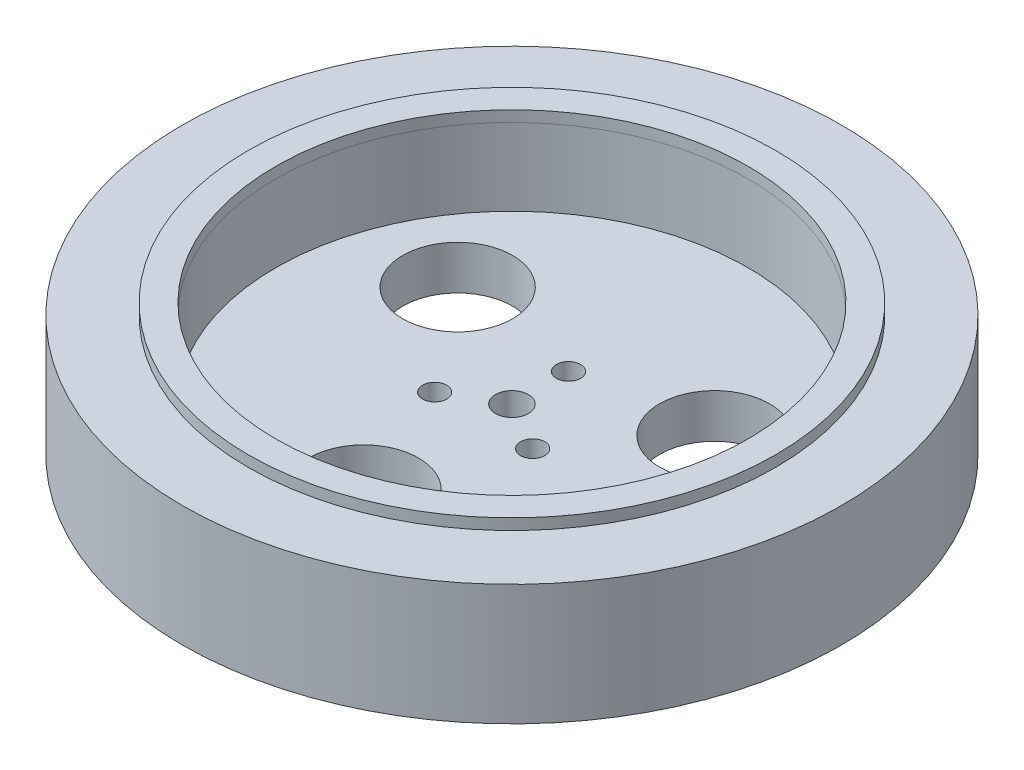
ISO-10303-21;
HEADER;
FILE_DESCRIPTION(('STEP AP214'),'2;1');
FILE_NAME('part.step','',(''),(''),'','','');
FILE_SCHEMA(('AUTOMOTIVE_DESIGN { 1 0 10303 214 1 1 1 1 }'));
ENDSEC;
DATA;
#1=APPLICATION_CONTEXT('core data for automotive mechanical design processes');
#2=APPLICATION_PROTOCOL_DEFINITION('international standard','automotive_design',2000,#1);
#3=PRODUCT_CONTEXT('',#1,'mechanical');
#4=PRODUCT('Part','Part','',(#3));
#5=PRODUCT_RELATED_PRODUCT_CATEGORY('part','',(#4));
#6=PRODUCT_DEFINITION_FORMATION('','',#4);
#7=PRODUCT_DEFINITION_CONTEXT('part definition',#1,'design');
#8=PRODUCT_DEFINITION('design','',#6,#7);
#9=PRODUCT_DEFINITION_SHAPE('','',#8);
#10=(LENGTH_UNIT() NAMED_UNIT(*) SI_UNIT(.MILLI.,.METRE.));
#11=(NAMED_UNIT(*) PLANE_ANGLE_UNIT() SI_UNIT($,.RADIAN.));
#12=(NAMED_UNIT(*) SI_UNIT($,.STERADIAN.) SOLID_ANGLE_UNIT());
#13=UNCERTAINTY_MEASURE_WITH_UNIT(LENGTH_MEASURE(1.E-05),#10,'distance_accuracy_value','');
#14=(GEOMETRIC_REPRESENTATION_CONTEXT(3) GLOBAL_UNCERTAINTY_ASSIGNED_CONTEXT((#13)) GLOBAL_UNIT_ASSIGNED_CONTEXT((#10,
#11,#12)) REPRESENTATION_CONTEXT('',''));
#15=CARTESIAN_POINT('',(0.,0.,0.));
#16=DIRECTION('',(0.,0.,1.));
#17=DIRECTION('',(1.,0.,0.));
#18=AXIS2_PLACEMENT_3D('',#15,#16,#17);
#19=CARTESIAN_POINT('',(0.,13.,0.));
#20=DIRECTION('',(0.,1.,0.));
#21=DIRECTION('',(0.,0.,1.));
#22=AXIS2_PLACEMENT_3D('',#19,#20,#21);
#23=PLANE('',#22);
#24=CARTESIAN_POINT('',(0.,13.,0.));
#25=DIRECTION('',(0.,1.,0.));
#26=DIRECTION('',(0.,0.,1.));
#27=AXIS2_PLACEMENT_3D('',#24,#25,#26);
#28=CIRCLE('',#27,24.);
#29=CARTESIAN_POINT('',(0.,13.,24.));
#30=VERTEX_POINT('',#29);
#31=EDGE_CURVE('E11',#30,#30,#28,.T.);
#32=ORIENTED_EDGE('',*,*,#31,.T.);
#33=EDGE_LOOP('',(#32));
#34=FACE_BOUND('',#33,.T.);
#35=CARTESIAN_POINT('',(0.,13.,0.));
#36=DIRECTION('',(0.,1.,0.));
#37=DIRECTION('',(0.,0.,1.));
#38=AXIS2_PLACEMENT_3D('',#35,#36,#37);
#39=CIRCLE('',#38,21.5);
#40=CARTESIAN_POINT('',(0.,13.,21.5));
#41=VERTEX_POINT('',#40);
#42=EDGE_CURVE('E54',#41,#41,#39,.T.);
#43=ORIENTED_EDGE('',*,*,#42,.F.);
#44=EDGE_LOOP('',(#43));
#45=FACE_BOUND('',#44,.T.);
#46=ADVANCED_FACE('F43',(#34,#45),#23,.T.);
#47=CARTESIAN_POINT('',(0.,12.,0.));
#48=DIRECTION('',(0.,1.,0.));
#49=DIRECTION('',(0.,0.,1.));
#50=AXIS2_PLACEMENT_3D('',#47,#48,#49);
#51=PLANE('',#50);
#52=CARTESIAN_POINT('',(0.,12.,0.));
#53=DIRECTION('',(0.,1.,0.));
#54=DIRECTION('',(0.,0.,1.));
#55=AXIS2_PLACEMENT_3D('',#52,#53,#54);
#56=CIRCLE('',#55,24.);
#57=CARTESIAN_POINT('',(0.,12.,24.));
#58=VERTEX_POINT('',#57);
#59=EDGE_CURVE('E47',#58,#58,#56,.T.);
#60=ORIENTED_EDGE('',*,*,#59,.F.);
#61=EDGE_LOOP('',(#60));
#62=FACE_BOUND('',#61,.T.);
#63=CARTESIAN_POINT('',(0.,12.,0.));
#64=DIRECTION('',(0.,1.,0.));
#65=DIRECTION('',(0.,0.,1.));
#66=AXIS2_PLACEMENT_3D('',#63,#64,#65);
#67=CIRCLE('',#66,21.5);
#68=CARTESIAN_POINT('',(0.,12.,21.5));
#69=VERTEX_POINT('',#68);
#70=EDGE_CURVE('E56',#69,#69,#67,.T.);
#71=ORIENTED_EDGE('',*,*,#70,.T.);
#72=EDGE_LOOP('',(#71));
#73=FACE_BOUND('',#72,.T.);
#74=ADVANCED_FACE('F66',(#62,#73),#51,.F.);
#75=CARTESIAN_POINT('',(0.,13.,0.));
#76=DIRECTION('',(0.,-1.,0.));
#77=DIRECTION('',(0.,0.,-1.));
#78=AXIS2_PLACEMENT_3D('',#75,#76,#77);
#79=CYLINDRICAL_SURFACE('',#78,24.);
#80=ORIENTED_EDGE('',*,*,#31,.F.);
#81=EDGE_LOOP('',(#80));
#82=FACE_BOUND('',#81,.T.);
#83=ORIENTED_EDGE('',*,*,#59,.T.);
#84=EDGE_LOOP('',(#83));
#85=FACE_BOUND('',#84,.T.);
#86=ADVANCED_FACE('F45',(#82,#85),#79,.T.);
#87=CARTESIAN_POINT('',(0.,13.,0.));
#88=DIRECTION('',(0.,-1.,0.));
#89=DIRECTION('',(0.,0.,-1.));
#90=AXIS2_PLACEMENT_3D('',#87,#88,#89);
#91=CYLINDRICAL_SURFACE('',#90,21.5);
#92=ORIENTED_EDGE('',*,*,#42,.T.);
#93=EDGE_LOOP('',(#92));
#94=FACE_BOUND('',#93,.T.);
#95=ORIENTED_EDGE('',*,*,#70,.F.);
#96=EDGE_LOOP('',(#95));
#97=FACE_BOUND('',#96,.T.);
#98=ADVANCED_FACE('F62',(#94,#97),#91,.F.);
#99=CLOSED_SHELL('',(#46,#74,#86,#98));
#100=MANIFOLD_SOLID_BREP('B2',#99);
#101=CARTESIAN_POINT('',(0.,1.,0.));
#102=DIRECTION('',(0.,1.,0.));
#103=DIRECTION('',(0.,0.,1.));
#104=AXIS2_PLACEMENT_3D('',#101,#102,#103);
#105=CYLINDRICAL_SURFACE('',#104,30.);
#106=CARTESIAN_POINT('',(0.,1.,0.));
#107=DIRECTION('',(0.,1.,0.));
#108=DIRECTION('',(0.,0.,1.));
#109=AXIS2_PLACEMENT_3D('',#106,#107,#108);
#110=CIRCLE('',#109,30.);
#111=CARTESIAN_POINT('',(0.,1.,30.));
#112=VERTEX_POINT('',#111);
#113=EDGE_CURVE('E42',#112,#112,#110,.T.);
#114=ORIENTED_EDGE('',*,*,#113,.T.);
#115=EDGE_LOOP('',(#114));
#116=FACE_BOUND('',#115,.T.);
#117=CARTESIAN_POINT('',(0.,12.,0.));
#118=DIRECTION('',(0.,1.,0.));
#119=DIRECTION('',(0.,0.,1.));
#120=AXIS2_PLACEMENT_3D('',#117,#118,#119);
#121=CIRCLE('',#120,30.);
#122=CARTESIAN_POINT('',(0.,12.,30.));
#123=VERTEX_POINT('',#122);
#124=EDGE_CURVE('E120',#123,#123,#121,.T.);
#125=ORIENTED_EDGE('',*,*,#124,.F.);
#126=EDGE_LOOP('',(#125));
#127=FACE_BOUND('',#126,.T.);
#128=ADVANCED_FACE('F117',(#116,#127),#105,.T.);
#129=CARTESIAN_POINT('',(0.,1.,0.));
#130=DIRECTION('',(0.,1.,0.));
#131=DIRECTION('',(0.,0.,1.));
#132=AXIS2_PLACEMENT_3D('',#129,#130,#131);
#133=PLANE('',#132);
#134=CARTESIAN_POINT('',(0.,1.,0.));
#135=DIRECTION('',(0.,1.,0.));
#136=DIRECTION('',(0.,0.,1.));
#137=AXIS2_PLACEMENT_3D('',#134,#135,#136);
#138=CIRCLE('',#137,24.);
#139=CARTESIAN_POINT('',(0.,1.,24.));
#140=VERTEX_POINT('',#139);
#141=EDGE_CURVE('E127',#140,#140,#138,.T.);
#142=ORIENTED_EDGE('',*,*,#141,.T.);
#143=EDGE_LOOP('',(#142));
#144=FACE_BOUND('',#143,.T.);
#145=ORIENTED_EDGE('',*,*,#113,.F.);
#146=EDGE_LOOP('',(#145));
#147=FACE_BOUND('',#146,.T.);
#148=ADVANCED_FACE('F135',(#144,#147),#133,.F.);
#149=CARTESIAN_POINT('',(0.,12.,0.));
#150=DIRECTION('',(0.,1.,0.));
#151=DIRECTION('',(0.,0.,1.));
#152=AXIS2_PLACEMENT_3D('',#149,#150,#151);
#153=PLANE('',#152);
#154=CARTESIAN_POINT('',(0.,12.,0.));
#155=DIRECTION('',(0.,1.,0.));
#156=DIRECTION('',(0.,0.,1.));
#157=AXIS2_PLACEMENT_3D('',#154,#155,#156);
#158=CIRCLE('',#157,24.);
#159=CARTESIAN_POINT('',(0.,12.,24.));
#160=VERTEX_POINT('',#159);
#161=EDGE_CURVE('E129',#160,#160,#158,.T.);
#162=ORIENTED_EDGE('',*,*,#161,.F.);
#163=EDGE_LOOP('',(#162));
#164=FACE_BOUND('',#163,.T.);
#165=ORIENTED_EDGE('',*,*,#124,.T.);
#166=EDGE_LOOP('',(#165));
#167=FACE_BOUND('',#166,.T.);
#168=ADVANCED_FACE('F141',(#164,#167),#153,.T.);
#169=CARTESIAN_POINT('',(0.,1.,0.));
#170=DIRECTION('',(0.,1.,0.));
#171=DIRECTION('',(0.,0.,1.));
#172=AXIS2_PLACEMENT_3D('',#169,#170,#171);
#173=CYLINDRICAL_SURFACE('',#172,24.);
#174=ORIENTED_EDGE('',*,*,#141,.F.);
#175=EDGE_LOOP('',(#174));
#176=FACE_BOUND('',#175,.T.);
#177=ORIENTED_EDGE('',*,*,#161,.T.);
#178=EDGE_LOOP('',(#177));
#179=FACE_BOUND('',#178,.T.);
#180=ADVANCED_FACE('F138',(#176,#179),#173,.F.);
#181=CLOSED_SHELL('',(#128,#148,#168,#180));
#182=MANIFOLD_SOLID_BREP('B6',#181);
#183=CARTESIAN_POINT('',(0.,12.,0.));
#184=DIRECTION('',(0.,-1.,0.));
#185=DIRECTION('',(0.,0.,-1.));
#186=AXIS2_PLACEMENT_3D('',#183,#184,#185);
#187=CYLINDRICAL_SURFACE('',#186,24.);
#188=CARTESIAN_POINT('',(0.,12.,0.));
#189=DIRECTION('',(0.,1.,0.));
#190=DIRECTION('',(0.,0.,1.));
#191=AXIS2_PLACEMENT_3D('',#188,#189,#190);
#192=CIRCLE('',#191,24.);
#193=CARTESIAN_POINT('',(0.,12.,24.));
#194=VERTEX_POINT('',#193);
#195=EDGE_CURVE('E116',#194,#194,#192,.T.);
#196=ORIENTED_EDGE('',*,*,#195,.F.);
#197=EDGE_LOOP('',(#196));
#198=FACE_BOUND('',#197,.T.);
#199=CARTESIAN_POINT('',(0.,1.,0.));
#200=DIRECTION('',(0.,-1.,0.));
#201=DIRECTION('',(0.,0.,-1.));
#202=AXIS2_PLACEMENT_3D('',#199,#200,#201);
#203=CIRCLE('',#202,24.);
#204=CARTESIAN_POINT('',(0.,1.,-24.));
#205=VERTEX_POINT('',#204);
#206=EDGE_CURVE('E215',#205,#205,#203,.T.);
#207=ORIENTED_EDGE('',*,*,#206,.F.);
#208=EDGE_LOOP('',(#207));
#209=FACE_BOUND('',#208,.T.);
#210=ADVANCED_FACE('F178',(#198,#209),#187,.T.);
#211=CARTESIAN_POINT('',(-4.46003082948988,0.,2.57499999999996));
#212=DIRECTION('',(0.,1.,0.));
#213=DIRECTION('',(0.,0.,1.));
#214=AXIS2_PLACEMENT_3D('',#211,#212,#213);
#215=CYLINDRICAL_SURFACE('',#214,1.1);
#216=CARTESIAN_POINT('',(-4.46003082948988,5.,2.57499999999996));
#217=DIRECTION('',(0.,1.,0.));
#218=DIRECTION('',(0.,0.,1.));
#219=AXIS2_PLACEMENT_3D('',#216,#217,#218);
#220=CIRCLE('',#219,1.1);
#221=CARTESIAN_POINT('',(-4.46003082948988,5.,3.67499999999996));
#222=VERTEX_POINT('',#221);
#223=EDGE_CURVE('E195',#222,#222,#220,.T.);
#224=ORIENTED_EDGE('',*,*,#223,.T.);
#225=EDGE_LOOP('',(#224));
#226=FACE_BOUND('',#225,.T.);
#227=CARTESIAN_POINT('',(-4.46003082948988,1.,2.57499999999996));
#228=DIRECTION('',(0.,-1.,0.));
#229=DIRECTION('',(0.,0.,-1.));
#230=AXIS2_PLACEMENT_3D('',#227,#228,#229);
#231=CIRCLE('',#230,1.1);
#232=CARTESIAN_POINT('',(-4.46003082948988,1.,1.47499999999996));
#233=VERTEX_POINT('',#232);
#234=EDGE_CURVE('E199',#233,#233,#231,.F.);
#235=ORIENTED_EDGE('',*,*,#234,.F.);
#236=EDGE_LOOP('',(#235));
#237=FACE_BOUND('',#236,.T.);
#238=ADVANCED_FACE('F281',(#226,#237),#215,.F.);
#239=CARTESIAN_POINT('',(4.46003082948985,0.,2.57500000000002));
#240=DIRECTION('',(0.,1.,0.));
#241=DIRECTION('',(0.,0.,1.));
#242=AXIS2_PLACEMENT_3D('',#239,#240,#241);
#243=CYLINDRICAL_SURFACE('',#242,1.1);
#244=CARTESIAN_POINT('',(4.46003082948985,5.,2.57500000000002));
#245=DIRECTION('',(0.,1.,0.));
#246=DIRECTION('',(0.,0.,1.));
#247=AXIS2_PLACEMENT_3D('',#244,#245,#246);
#248=CIRCLE('',#247,1.1);
#249=CARTESIAN_POINT('',(4.46003082948985,5.,3.67500000000002));
#250=VERTEX_POINT('',#249);
#251=EDGE_CURVE('E198',#250,#250,#248,.T.);
#252=ORIENTED_EDGE('',*,*,#251,.T.);
#253=EDGE_LOOP('',(#252));
#254=FACE_BOUND('',#253,.T.);
#255=CARTESIAN_POINT('',(4.46003082948985,1.,2.57500000000002));
#256=DIRECTION('',(0.,-1.,0.));
#257=DIRECTION('',(0.,0.,-1.));
#258=AXIS2_PLACEMENT_3D('',#255,#256,#257);
#259=CIRCLE('',#258,1.1);
#260=CARTESIAN_POINT('',(4.46003082948985,1.,1.47500000000002));
#261=VERTEX_POINT('',#260);
#262=EDGE_CURVE('E209',#261,#261,#259,.F.);
#263=ORIENTED_EDGE('',*,*,#262,.F.);
#264=EDGE_LOOP('',(#263));
#265=FACE_BOUND('',#264,.T.);
#266=ADVANCED_FACE('F286',(#254,#265),#243,.F.);
#267=CARTESIAN_POINT('',(0.,0.,0.));
#268=DIRECTION('',(0.,1.,0.));
#269=DIRECTION('',(0.,0.,1.));
#270=AXIS2_PLACEMENT_3D('',#267,#268,#269);
#271=CYLINDRICAL_SURFACE('',#270,1.5);
#272=CARTESIAN_POINT('',(0.,5.,0.));
#273=DIRECTION('',(0.,1.,0.));
#274=DIRECTION('',(0.,0.,1.));
#275=AXIS2_PLACEMENT_3D('',#272,#273,#274);
#276=CIRCLE('',#275,1.5);
#277=CARTESIAN_POINT('',(0.,5.,1.5));
#278=VERTEX_POINT('',#277);
#279=EDGE_CURVE('E202',#278,#278,#276,.T.);
#280=ORIENTED_EDGE('',*,*,#279,.T.);
#281=EDGE_LOOP('',(#280));
#282=FACE_BOUND('',#281,.T.);
#283=CARTESIAN_POINT('',(0.,1.,0.));
#284=DIRECTION('',(0.,-1.,0.));
#285=DIRECTION('',(0.,0.,-1.));
#286=AXIS2_PLACEMENT_3D('',#283,#284,#285);
#287=CIRCLE('',#286,1.5);
#288=CARTESIAN_POINT('',(0.,1.,-1.5));
#289=VERTEX_POINT('',#288);
#290=EDGE_CURVE('E212',#289,#289,#287,.F.);
#291=ORIENTED_EDGE('',*,*,#290,.F.);
#292=EDGE_LOOP('',(#291));
#293=FACE_BOUND('',#292,.T.);
#294=ADVANCED_FACE('F277',(#282,#293),#271,.F.);
#295=CARTESIAN_POINT('',(0.,0.,-5.15));
#296=DIRECTION('',(0.,1.,0.));
#297=DIRECTION('',(0.,0.,1.));
#298=AXIS2_PLACEMENT_3D('',#295,#296,#297);
#299=CYLINDRICAL_SURFACE('',#298,1.1);
#300=CARTESIAN_POINT('',(0.,5.,-5.15));
#301=DIRECTION('',(0.,1.,0.));
#302=DIRECTION('',(0.,0.,1.));
#303=AXIS2_PLACEMENT_3D('',#300,#301,#302);
#304=CIRCLE('',#303,1.1);
#305=CARTESIAN_POINT('',(0.,5.,-4.05));
#306=VERTEX_POINT('',#305);
#307=EDGE_CURVE('E193',#306,#306,#304,.T.);
#308=ORIENTED_EDGE('',*,*,#307,.T.);
#309=EDGE_LOOP('',(#308));
#310=FACE_BOUND('',#309,.T.);
#311=CARTESIAN_POINT('',(0.,1.,-5.15));
#312=DIRECTION('',(0.,-1.,0.));
#313=DIRECTION('',(0.,0.,-1.));
#314=AXIS2_PLACEMENT_3D('',#311,#312,#313);
#315=CIRCLE('',#314,1.1);
#316=CARTESIAN_POINT('',(0.,1.,-6.25));
#317=VERTEX_POINT('',#316);
#318=EDGE_CURVE('E181',#317,#317,#315,.F.);
#319=ORIENTED_EDGE('',*,*,#318,.F.);
#320=EDGE_LOOP('',(#319));
#321=FACE_BOUND('',#320,.T.);
#322=ADVANCED_FACE('F273',(#310,#321),#299,.F.);
#323=CARTESIAN_POINT('',(0.,12.,0.));
#324=DIRECTION('',(0.,1.,0.));
#325=DIRECTION('',(0.,0.,1.));
#326=AXIS2_PLACEMENT_3D('',#323,#324,#325);
#327=PLANE('',#326);
#328=CARTESIAN_POINT('',(0.,12.,0.));
#329=DIRECTION('',(0.,1.,0.));
#330=DIRECTION('',(0.,0.,1.));
#331=AXIS2_PLACEMENT_3D('',#328,#329,#330);
#332=CIRCLE('',#331,21.5);
#333=CARTESIAN_POINT('',(0.,12.,21.5));
#334=VERTEX_POINT('',#333);
#335=EDGE_CURVE('E189',#334,#334,#332,.T.);
#336=ORIENTED_EDGE('',*,*,#335,.F.);
#337=EDGE_LOOP('',(#336));
#338=FACE_BOUND('',#337,.T.);
#339=ORIENTED_EDGE('',*,*,#195,.T.);
#340=EDGE_LOOP('',(#339));
#341=FACE_BOUND('',#340,.T.);
#342=ADVANCED_FACE('F268',(#338,#341),#327,.T.);
#343=CARTESIAN_POINT('',(0.,5.,0.));
#344=DIRECTION('',(0.,1.,0.));
#345=DIRECTION('',(0.,0.,1.));
#346=AXIS2_PLACEMENT_3D('',#343,#344,#345);
#347=CYLINDRICAL_SURFACE('',#346,21.5);
#348=CARTESIAN_POINT('',(0.,5.,0.));
#349=DIRECTION('',(0.,1.,0.));
#350=DIRECTION('',(0.,0.,1.));
#351=AXIS2_PLACEMENT_3D('',#348,#349,#350);
#352=CIRCLE('',#351,21.5);
#353=CARTESIAN_POINT('',(0.,5.,21.5));
#354=VERTEX_POINT('',#353);
#355=EDGE_CURVE('E185',#354,#354,#352,.T.);
#356=ORIENTED_EDGE('',*,*,#355,.F.);
#357=EDGE_LOOP('',(#356));
#358=FACE_BOUND('',#357,.T.);
#359=ORIENTED_EDGE('',*,*,#335,.T.);
#360=EDGE_LOOP('',(#359));
#361=FACE_BOUND('',#360,.T.);
#362=ADVANCED_FACE('F250',(#358,#361),#347,.F.);
#363=CARTESIAN_POINT('',(0.,5.,0.));
#364=DIRECTION('',(0.,1.,0.));
#365=DIRECTION('',(0.,0.,1.));
#366=AXIS2_PLACEMENT_3D('',#363,#364,#365);
#367=PLANE('',#366);
#368=CARTESIAN_POINT('',(-11.6913429510899,5.,-6.75000000000005));
#369=DIRECTION('',(0.,1.,0.));
#370=DIRECTION('',(0.,0.,1.));
#371=AXIS2_PLACEMENT_3D('',#368,#369,#370);
#372=CIRCLE('',#371,5.);
#373=CARTESIAN_POINT('',(-11.6913429510899,5.,-1.75000000000005));
#374=VERTEX_POINT('',#373);
#375=EDGE_CURVE('E231',#374,#374,#372,.T.);
#376=ORIENTED_EDGE('',*,*,#375,.F.);
#377=EDGE_LOOP('',(#376));
#378=FACE_BOUND('',#377,.T.);
#379=CARTESIAN_POINT('',(11.69134295109,5.,-6.75000000000094));
#380=DIRECTION('',(0.,1.,0.));
#381=DIRECTION('',(0.,0.,1.));
#382=AXIS2_PLACEMENT_3D('',#379,#380,#381);
#383=CIRCLE('',#382,5.);
#384=CARTESIAN_POINT('',(11.69134295109,5.,-1.75000000000093));
#385=VERTEX_POINT('',#384);
#386=EDGE_CURVE('E225',#385,#385,#383,.T.);
#387=ORIENTED_EDGE('',*,*,#386,.F.);
#388=EDGE_LOOP('',(#387));
#389=FACE_BOUND('',#388,.T.);
#390=CARTESIAN_POINT('',(7.99589520963085E-13,5.,13.4999999999995));
#391=DIRECTION('',(0.,1.,0.));
#392=DIRECTION('',(0.,0.,1.));
#393=AXIS2_PLACEMENT_3D('',#390,#391,#392);
#394=CIRCLE('',#393,5.);
#395=CARTESIAN_POINT('',(7.99589520963085E-13,5.,18.4999999999995));
#396=VERTEX_POINT('',#395);
#397=EDGE_CURVE('E219',#396,#396,#394,.T.);
#398=ORIENTED_EDGE('',*,*,#397,.F.);
#399=EDGE_LOOP('',(#398));
#400=FACE_BOUND('',#399,.T.);
#401=ORIENTED_EDGE('',*,*,#307,.F.);
#402=EDGE_LOOP('',(#401));
#403=FACE_BOUND('',#402,.T.);
#404=ORIENTED_EDGE('',*,*,#279,.F.);
#405=EDGE_LOOP('',(#404));
#406=FACE_BOUND('',#405,.T.);
#407=ORIENTED_EDGE('',*,*,#251,.F.);
#408=EDGE_LOOP('',(#407));
#409=FACE_BOUND('',#408,.T.);
#410=ORIENTED_EDGE('',*,*,#223,.F.);
#411=EDGE_LOOP('',(#410));
#412=FACE_BOUND('',#411,.T.);
#413=ORIENTED_EDGE('',*,*,#355,.T.);
#414=EDGE_LOOP('',(#413));
#415=FACE_BOUND('',#414,.T.);
#416=ADVANCED_FACE('F247',(#378,#389,#400,#403,#406,#409,#412,#415),#367,.T.);
#417=CARTESIAN_POINT('',(0.,1.,0.));
#418=DIRECTION('',(0.,-1.,0.));
#419=DIRECTION('',(0.,0.,-1.));
#420=AXIS2_PLACEMENT_3D('',#417,#418,#419);
#421=PLANE('',#420);
#422=CARTESIAN_POINT('',(-11.6913429510899,1.,-6.75000000000005));
#423=DIRECTION('',(0.,1.,0.));
#424=DIRECTION('',(0.,0.,1.));
#425=AXIS2_PLACEMENT_3D('',#422,#423,#424);
#426=CIRCLE('',#425,5.);
#427=CARTESIAN_POINT('',(-11.6913429510899,1.,-1.75000000000005));
#428=VERTEX_POINT('',#427);
#429=EDGE_CURVE('E218',#428,#428,#426,.T.);
#430=ORIENTED_EDGE('',*,*,#429,.T.);
#431=EDGE_LOOP('',(#430));
#432=FACE_BOUND('',#431,.T.);
#433=CARTESIAN_POINT('',(11.69134295109,1.,-6.75000000000094));
#434=DIRECTION('',(0.,1.,0.));
#435=DIRECTION('',(0.,0.,1.));
#436=AXIS2_PLACEMENT_3D('',#433,#434,#435);
#437=CIRCLE('',#436,5.);
#438=CARTESIAN_POINT('',(11.69134295109,1.,-1.75000000000093));
#439=VERTEX_POINT('',#438);
#440=EDGE_CURVE('E228',#439,#439,#437,.T.);
#441=ORIENTED_EDGE('',*,*,#440,.T.);
#442=EDGE_LOOP('',(#441));
#443=FACE_BOUND('',#442,.T.);
#444=CARTESIAN_POINT('',(7.99589520963085E-13,1.,13.4999999999995));
#445=DIRECTION('',(0.,1.,0.));
#446=DIRECTION('',(0.,0.,1.));
#447=AXIS2_PLACEMENT_3D('',#444,#445,#446);
#448=CIRCLE('',#447,5.);
#449=CARTESIAN_POINT('',(7.99589520963085E-13,1.,18.4999999999995));
#450=VERTEX_POINT('',#449);
#451=EDGE_CURVE('E222',#450,#450,#448,.T.);
#452=ORIENTED_EDGE('',*,*,#451,.T.);
#453=EDGE_LOOP('',(#452));
#454=FACE_BOUND('',#453,.T.);
#455=ORIENTED_EDGE('',*,*,#206,.T.);
#456=EDGE_LOOP('',(#455));
#457=FACE_BOUND('',#456,.T.);
#458=ORIENTED_EDGE('',*,*,#318,.T.);
#459=EDGE_LOOP('',(#458));
#460=FACE_BOUND('',#459,.T.);
#461=ORIENTED_EDGE('',*,*,#290,.T.);
#462=EDGE_LOOP('',(#461));
#463=FACE_BOUND('',#462,.T.);
#464=ORIENTED_EDGE('',*,*,#262,.T.);
#465=EDGE_LOOP('',(#464));
#466=FACE_BOUND('',#465,.T.);
#467=ORIENTED_EDGE('',*,*,#234,.T.);
#468=EDGE_LOOP('',(#467));
#469=FACE_BOUND('',#468,.T.);
#470=ADVANCED_FACE('F237',(#432,#443,#454,#457,#460,#463,#466,#469),#421,.T.);
#471=CARTESIAN_POINT('',(7.99589520963085E-13,1.,13.4999999999995));
#472=DIRECTION('',(0.,1.,0.));
#473=DIRECTION('',(0.,0.,1.));
#474=AXIS2_PLACEMENT_3D('',#471,#472,#473);
#475=CYLINDRICAL_SURFACE('',#474,5.);
#476=ORIENTED_EDGE('',*,*,#451,.F.);
#477=EDGE_LOOP('',(#476));
#478=FACE_BOUND('',#477,.T.);
#479=ORIENTED_EDGE('',*,*,#397,.T.);
#480=EDGE_LOOP('',(#479));
#481=FACE_BOUND('',#480,.T.);
#482=ADVANCED_FACE('F294',(#478,#481),#475,.F.);
#483=CARTESIAN_POINT('',(11.69134295109,1.,-6.75000000000094));
#484=DIRECTION('',(0.,1.,0.));
#485=DIRECTION('',(0.,0.,1.));
#486=AXIS2_PLACEMENT_3D('',#483,#484,#485);
#487=CYLINDRICAL_SURFACE('',#486,5.);
#488=ORIENTED_EDGE('',*,*,#440,.F.);
#489=EDGE_LOOP('',(#488));
#490=FACE_BOUND('',#489,.T.);
#491=ORIENTED_EDGE('',*,*,#386,.T.);
#492=EDGE_LOOP('',(#491));
#493=FACE_BOUND('',#492,.T.);
#494=ADVANCED_FACE('F243',(#490,#493),#487,.F.);
#495=CARTESIAN_POINT('',(-11.6913429510899,1.,-6.75000000000005));
#496=DIRECTION('',(0.,1.,0.));
#497=DIRECTION('',(0.,0.,1.));
#498=AXIS2_PLACEMENT_3D('',#495,#496,#497);
#499=CYLINDRICAL_SURFACE('',#498,5.);
#500=ORIENTED_EDGE('',*,*,#429,.F.);
#501=EDGE_LOOP('',(#500));
#502=FACE_BOUND('',#501,.T.);
#503=ORIENTED_EDGE('',*,*,#375,.T.);
#504=EDGE_LOOP('',(#503));
#505=FACE_BOUND('',#504,.T.);
#506=ADVANCED_FACE('F240',(#502,#505),#499,.F.);
#507=CLOSED_SHELL('',(#210,#238,#266,#294,#322,#342,#362,#416,#470,#482,#494,#506));
#508=MANIFOLD_SOLID_BREP('B37',#507);
#509=ADVANCED_BREP_SHAPE_REPRESENTATION('',(#18,#100,#182,#508),#14);
#510=SHAPE_DEFINITION_REPRESENTATION(#9,#509);
ENDSEC;
END-ISO-10303-21;
